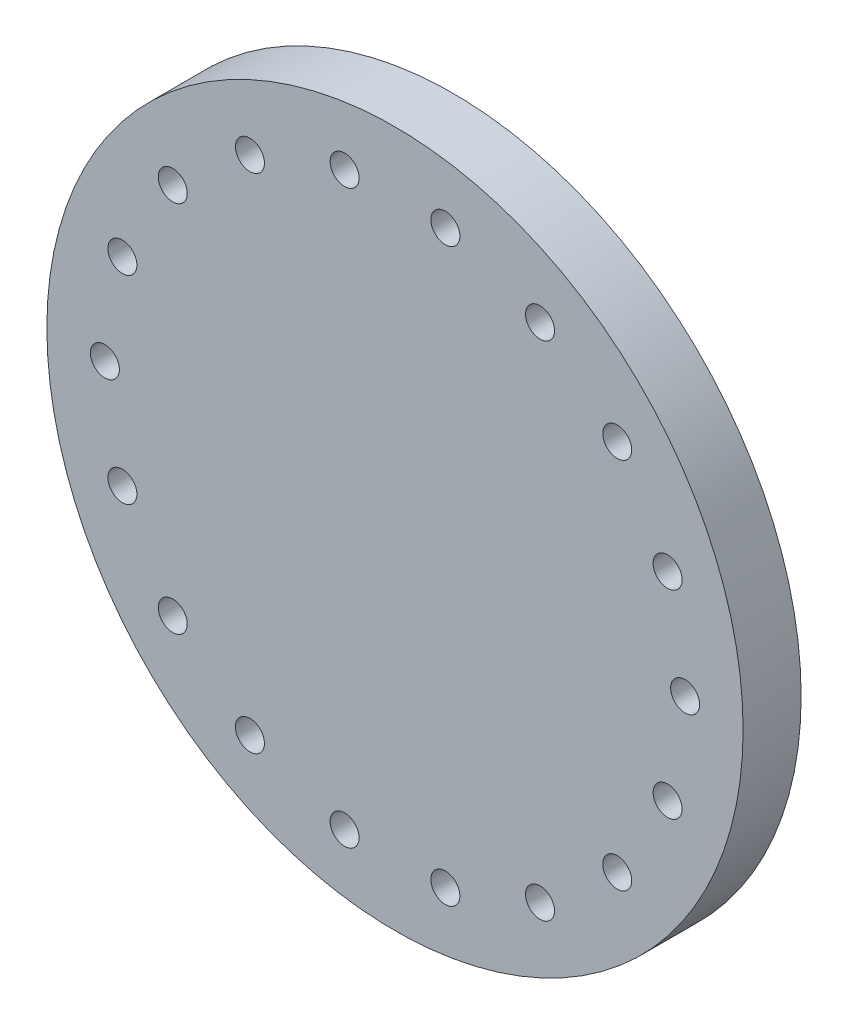
ISO-10303-21;
HEADER;
FILE_DESCRIPTION(('STEP AP214'),'2;1');
FILE_NAME('part.step','',(''),(''),'','','');
FILE_SCHEMA(('AUTOMOTIVE_DESIGN { 1 0 10303 214 1 1 1 1 }'));
ENDSEC;
DATA;
#1=APPLICATION_CONTEXT('core data for automotive mechanical design processes');
#2=APPLICATION_PROTOCOL_DEFINITION('international standard','automotive_design',2000,#1);
#3=PRODUCT_CONTEXT('',#1,'mechanical');
#4=PRODUCT('Part','Part','',(#3));
#5=PRODUCT_RELATED_PRODUCT_CATEGORY('part','',(#4));
#6=PRODUCT_DEFINITION_FORMATION('','',#4);
#7=PRODUCT_DEFINITION_CONTEXT('part definition',#1,'design');
#8=PRODUCT_DEFINITION('design','',#6,#7);
#9=PRODUCT_DEFINITION_SHAPE('','',#8);
#10=(LENGTH_UNIT() NAMED_UNIT(*) SI_UNIT(.MILLI.,.METRE.));
#11=(NAMED_UNIT(*) PLANE_ANGLE_UNIT() SI_UNIT($,.RADIAN.));
#12=(NAMED_UNIT(*) SI_UNIT($,.STERADIAN.) SOLID_ANGLE_UNIT());
#13=UNCERTAINTY_MEASURE_WITH_UNIT(LENGTH_MEASURE(1.E-05),#10,'distance_accuracy_value','');
#14=(GEOMETRIC_REPRESENTATION_CONTEXT(3) GLOBAL_UNCERTAINTY_ASSIGNED_CONTEXT((#13)) GLOBAL_UNIT_ASSIGNED_CONTEXT((#10,
#11,#12)) REPRESENTATION_CONTEXT('',''));
#15=CARTESIAN_POINT('',(0.,0.,0.));
#16=DIRECTION('',(0.,0.,1.));
#17=DIRECTION('',(1.,0.,0.));
#18=AXIS2_PLACEMENT_3D('',#15,#16,#17);
#19=CARTESIAN_POINT('',(0.,0.,12.7));
#20=DIRECTION('',(0.,0.,1.));
#21=DIRECTION('',(1.,0.,0.));
#22=AXIS2_PLACEMENT_3D('',#19,#20,#21);
#23=PLANE('',#22);
#24=CARTESIAN_POINT('',(-48.6438221380556,-40.8170132150947,12.7));
#25=DIRECTION('',(0.,0.,1.));
#26=DIRECTION('',(1.,0.,0.));
#27=AXIS2_PLACEMENT_3D('',#24,#25,#26);
#28=CIRCLE('',#27,3.175);
#29=CARTESIAN_POINT('',(-45.4688221380556,-40.8170132150947,12.7));
#30=VERTEX_POINT('',#29);
#31=EDGE_CURVE('E182',#30,#30,#28,.T.);
#32=ORIENTED_EDGE('',*,*,#31,.F.);
#33=EDGE_LOOP('',(#32));
#34=FACE_BOUND('',#33,.T.);
#35=CARTESIAN_POINT('',(-11.0266592818507,-62.5352923162751,12.7));
#36=DIRECTION('',(0.,0.,1.));
#37=DIRECTION('',(1.,0.,0.));
#38=AXIS2_PLACEMENT_3D('',#35,#36,#37);
#39=CIRCLE('',#38,3.175);
#40=CARTESIAN_POINT('',(-7.85165928185072,-62.5352923162751,12.7));
#41=VERTEX_POINT('',#40);
#42=EDGE_CURVE('E166',#41,#41,#39,.T.);
#43=ORIENTED_EDGE('',*,*,#42,.F.);
#44=EDGE_LOOP('',(#43));
#45=FACE_BOUND('',#44,.T.);
#46=CARTESIAN_POINT('',(31.7499999999995,-54.9926131403121,12.7));
#47=DIRECTION('',(0.,0.,1.));
#48=DIRECTION('',(1.,0.,0.));
#49=AXIS2_PLACEMENT_3D('',#46,#47,#48);
#50=CIRCLE('',#49,3.175);
#51=CARTESIAN_POINT('',(34.9249999999995,-54.9926131403121,12.7));
#52=VERTEX_POINT('',#51);
#53=EDGE_CURVE('E150',#52,#52,#50,.T.);
#54=ORIENTED_EDGE('',*,*,#53,.F.);
#55=EDGE_LOOP('',(#54));
#56=FACE_BOUND('',#55,.T.);
#57=CARTESIAN_POINT('',(59.670481419905,-21.7182791011804,12.7));
#58=DIRECTION('',(0.,0.,1.));
#59=DIRECTION('',(1.,0.,0.));
#60=AXIS2_PLACEMENT_3D('',#57,#58,#59);
#61=CIRCLE('',#60,3.175);
#62=CARTESIAN_POINT('',(62.845481419905,-21.7182791011804,12.7));
#63=VERTEX_POINT('',#62);
#64=EDGE_CURVE('E134',#63,#63,#61,.T.);
#65=ORIENTED_EDGE('',*,*,#64,.F.);
#66=EDGE_LOOP('',(#65));
#67=FACE_BOUND('',#66,.T.);
#68=CARTESIAN_POINT('',(59.6704814199053,21.7182791011796,12.7));
#69=DIRECTION('',(0.,0.,1.));
#70=DIRECTION('',(1.,0.,0.));
#71=AXIS2_PLACEMENT_3D('',#68,#69,#70);
#72=CIRCLE('',#71,3.175);
#73=CARTESIAN_POINT('',(62.8454814199053,21.7182791011796,12.7));
#74=VERTEX_POINT('',#73);
#75=EDGE_CURVE('E118',#74,#74,#72,.T.);
#76=ORIENTED_EDGE('',*,*,#75,.F.);
#77=EDGE_LOOP('',(#76));
#78=FACE_BOUND('',#77,.T.);
#79=CARTESIAN_POINT('',(31.7500000000003,54.9926131403117,12.7));
#80=DIRECTION('',(0.,0.,1.));
#81=DIRECTION('',(1.,0.,0.));
#82=AXIS2_PLACEMENT_3D('',#79,#80,#81);
#83=CIRCLE('',#82,3.175);
#84=CARTESIAN_POINT('',(34.9250000000003,54.9926131403117,12.7));
#85=VERTEX_POINT('',#84);
#86=EDGE_CURVE('E102',#85,#85,#83,.T.);
#87=ORIENTED_EDGE('',*,*,#86,.F.);
#88=EDGE_LOOP('',(#87));
#89=FACE_BOUND('',#88,.T.);
#90=CARTESIAN_POINT('',(-11.0266592818499,62.5352923162752,12.7));
#91=DIRECTION('',(0.,0.,1.));
#92=DIRECTION('',(1.,0.,0.));
#93=AXIS2_PLACEMENT_3D('',#90,#91,#92);
#94=CIRCLE('',#93,3.175);
#95=CARTESIAN_POINT('',(-7.85165928184989,62.5352923162752,12.7));
#96=VERTEX_POINT('',#95);
#97=EDGE_CURVE('E86',#96,#96,#94,.T.);
#98=ORIENTED_EDGE('',*,*,#97,.F.);
#99=EDGE_LOOP('',(#98));
#100=FACE_BOUND('',#99,.T.);
#101=CARTESIAN_POINT('',(-48.6438221380551,40.8170132150953,12.7));
#102=DIRECTION('',(0.,0.,1.));
#103=DIRECTION('',(1.,0.,0.));
#104=AXIS2_PLACEMENT_3D('',#101,#102,#103);
#105=CIRCLE('',#104,3.175);
#106=CARTESIAN_POINT('',(-45.4688221380551,40.8170132150953,12.7));
#107=VERTEX_POINT('',#106);
#108=EDGE_CURVE('E70',#107,#107,#105,.T.);
#109=ORIENTED_EDGE('',*,*,#108,.F.);
#110=EDGE_LOOP('',(#109));
#111=FACE_BOUND('',#110,.T.);
#112=CARTESIAN_POINT('',(-63.5,0.,12.7));
#113=DIRECTION('',(0.,0.,1.));
#114=DIRECTION('',(1.,0.,0.));
#115=AXIS2_PLACEMENT_3D('',#112,#113,#114);
#116=CIRCLE('',#115,3.175);
#117=CARTESIAN_POINT('',(-60.325,0.,12.7));
#118=VERTEX_POINT('',#117);
#119=EDGE_CURVE('E56',#118,#118,#116,.T.);
#120=ORIENTED_EDGE('',*,*,#119,.F.);
#121=EDGE_LOOP('',(#120));
#122=FACE_BOUND('',#121,.T.);
#123=CARTESIAN_POINT('',(0.,0.,12.7));
#124=DIRECTION('',(0.,0.,1.));
#125=DIRECTION('',(1.,0.,0.));
#126=AXIS2_PLACEMENT_3D('',#123,#124,#125);
#127=CIRCLE('',#126,76.2);
#128=CARTESIAN_POINT('',(76.2,0.,12.7));
#129=VERTEX_POINT('',#128);
#130=EDGE_CURVE('E10',#129,#129,#127,.T.);
#131=ORIENTED_EDGE('',*,*,#130,.T.);
#132=EDGE_LOOP('',(#131));
#133=FACE_BOUND('',#132,.T.);
#134=CARTESIAN_POINT('',(-59.6704814199052,21.71827910118,12.7));
#135=DIRECTION('',(0.,0.,1.));
#136=DIRECTION('',(1.,0.,0.));
#137=AXIS2_PLACEMENT_3D('',#134,#135,#136);
#138=CIRCLE('',#137,3.175);
#139=CARTESIAN_POINT('',(-56.4954814199052,21.71827910118,12.7));
#140=VERTEX_POINT('',#139);
#141=EDGE_CURVE('E62',#140,#140,#138,.T.);
#142=ORIENTED_EDGE('',*,*,#141,.F.);
#143=EDGE_LOOP('',(#142));
#144=FACE_BOUND('',#143,.T.);
#145=CARTESIAN_POINT('',(-31.7499999999999,54.9926131403119,12.7));
#146=DIRECTION('',(0.,0.,1.));
#147=DIRECTION('',(1.,0.,0.));
#148=AXIS2_PLACEMENT_3D('',#145,#146,#147);
#149=CIRCLE('',#148,3.175);
#150=CARTESIAN_POINT('',(-28.5749999999999,54.9926131403119,12.7));
#151=VERTEX_POINT('',#150);
#152=EDGE_CURVE('E78',#151,#151,#149,.T.);
#153=ORIENTED_EDGE('',*,*,#152,.F.);
#154=EDGE_LOOP('',(#153));
#155=FACE_BOUND('',#154,.T.);
#156=CARTESIAN_POINT('',(11.0266592818503,62.5352923162752,12.7));
#157=DIRECTION('',(0.,0.,1.));
#158=DIRECTION('',(1.,0.,0.));
#159=AXIS2_PLACEMENT_3D('',#156,#157,#158);
#160=CIRCLE('',#159,3.175);
#161=CARTESIAN_POINT('',(14.2016592818503,62.5352923162752,12.7));
#162=VERTEX_POINT('',#161);
#163=EDGE_CURVE('E94',#162,#162,#160,.T.);
#164=ORIENTED_EDGE('',*,*,#163,.F.);
#165=EDGE_LOOP('',(#164));
#166=FACE_BOUND('',#165,.T.);
#167=CARTESIAN_POINT('',(48.6438221380553,40.817013215095,12.7));
#168=DIRECTION('',(0.,0.,1.));
#169=DIRECTION('',(1.,0.,0.));
#170=AXIS2_PLACEMENT_3D('',#167,#168,#169);
#171=CIRCLE('',#170,3.175);
#172=CARTESIAN_POINT('',(51.8188221380553,40.817013215095,12.7));
#173=VERTEX_POINT('',#172);
#174=EDGE_CURVE('E110',#173,#173,#171,.T.);
#175=ORIENTED_EDGE('',*,*,#174,.F.);
#176=EDGE_LOOP('',(#175));
#177=FACE_BOUND('',#176,.T.);
#178=CARTESIAN_POINT('',(63.5,-4.43418130033078E-13,12.7));
#179=DIRECTION('',(0.,0.,1.));
#180=DIRECTION('',(1.,0.,0.));
#181=AXIS2_PLACEMENT_3D('',#178,#179,#180);
#182=CIRCLE('',#181,3.175);
#183=CARTESIAN_POINT('',(66.675,-4.43418130033078E-13,12.7));
#184=VERTEX_POINT('',#183);
#185=EDGE_CURVE('E126',#184,#184,#182,.T.);
#186=ORIENTED_EDGE('',*,*,#185,.F.);
#187=EDGE_LOOP('',(#186));
#188=FACE_BOUND('',#187,.T.);
#189=CARTESIAN_POINT('',(48.6438221380548,-40.8170132150957,12.7));
#190=DIRECTION('',(0.,0.,1.));
#191=DIRECTION('',(1.,0.,0.));
#192=AXIS2_PLACEMENT_3D('',#189,#190,#191);
#193=CIRCLE('',#192,3.175);
#194=CARTESIAN_POINT('',(51.8188221380548,-40.8170132150957,12.7));
#195=VERTEX_POINT('',#194);
#196=EDGE_CURVE('E142',#195,#195,#193,.T.);
#197=ORIENTED_EDGE('',*,*,#196,.F.);
#198=EDGE_LOOP('',(#197));
#199=FACE_BOUND('',#198,.T.);
#200=CARTESIAN_POINT('',(11.0266592818495,-62.5352923162753,12.7));
#201=DIRECTION('',(0.,0.,1.));
#202=DIRECTION('',(1.,0.,0.));
#203=AXIS2_PLACEMENT_3D('',#200,#201,#202);
#204=CIRCLE('',#203,3.175);
#205=CARTESIAN_POINT('',(14.2016592818495,-62.5352923162753,12.7));
#206=VERTEX_POINT('',#205);
#207=EDGE_CURVE('E158',#206,#206,#204,.T.);
#208=ORIENTED_EDGE('',*,*,#207,.F.);
#209=EDGE_LOOP('',(#208));
#210=FACE_BOUND('',#209,.T.);
#211=CARTESIAN_POINT('',(-31.7500000000006,-54.9926131403115,12.7));
#212=DIRECTION('',(0.,0.,1.));
#213=DIRECTION('',(1.,0.,0.));
#214=AXIS2_PLACEMENT_3D('',#211,#212,#213);
#215=CIRCLE('',#214,3.175);
#216=CARTESIAN_POINT('',(-28.5750000000006,-54.9926131403115,12.7));
#217=VERTEX_POINT('',#216);
#218=EDGE_CURVE('E174',#217,#217,#215,.T.);
#219=ORIENTED_EDGE('',*,*,#218,.F.);
#220=EDGE_LOOP('',(#219));
#221=FACE_BOUND('',#220,.T.);
#222=CARTESIAN_POINT('',(-59.6704814199055,-21.7182791011792,12.7));
#223=DIRECTION('',(0.,0.,1.));
#224=DIRECTION('',(1.,0.,0.));
#225=AXIS2_PLACEMENT_3D('',#222,#223,#224);
#226=CIRCLE('',#225,3.175);
#227=CARTESIAN_POINT('',(-56.4954814199055,-21.7182791011792,12.7));
#228=VERTEX_POINT('',#227);
#229=EDGE_CURVE('E190',#228,#228,#226,.T.);
#230=ORIENTED_EDGE('',*,*,#229,.F.);
#231=EDGE_LOOP('',(#230));
#232=FACE_BOUND('',#231,.T.);
#233=ADVANCED_FACE('F43',(#34,#45,#56,#67,#78,#89,#100,#111,#122,#133,#144,#155,#166,#177,#188,
#199,#210,#221,#232),#23,.T.);
#234=CARTESIAN_POINT('',(0.,0.,0.));
#235=DIRECTION('',(0.,0.,1.));
#236=DIRECTION('',(1.,0.,0.));
#237=AXIS2_PLACEMENT_3D('',#234,#235,#236);
#238=PLANE('',#237);
#239=CARTESIAN_POINT('',(0.,0.,0.));
#240=DIRECTION('',(0.,0.,1.));
#241=DIRECTION('',(1.,0.,0.));
#242=AXIS2_PLACEMENT_3D('',#239,#240,#241);
#243=CIRCLE('',#242,76.2);
#244=CARTESIAN_POINT('',(76.2,0.,0.));
#245=VERTEX_POINT('',#244);
#246=EDGE_CURVE('E47',#245,#245,#243,.T.);
#247=ORIENTED_EDGE('',*,*,#246,.F.);
#248=EDGE_LOOP('',(#247));
#249=FACE_BOUND('',#248,.T.);
#250=CARTESIAN_POINT('',(-63.5,0.,0.));
#251=DIRECTION('',(0.,0.,1.));
#252=DIRECTION('',(1.,0.,0.));
#253=AXIS2_PLACEMENT_3D('',#250,#251,#252);
#254=CIRCLE('',#253,3.175);
#255=CARTESIAN_POINT('',(-60.325,0.,0.));
#256=VERTEX_POINT('',#255);
#257=EDGE_CURVE('E58',#256,#256,#254,.T.);
#258=ORIENTED_EDGE('',*,*,#257,.T.);
#259=EDGE_LOOP('',(#258));
#260=FACE_BOUND('',#259,.T.);
#261=CARTESIAN_POINT('',(-59.6704814199052,21.71827910118,0.));
#262=DIRECTION('',(0.,0.,1.));
#263=DIRECTION('',(1.,0.,0.));
#264=AXIS2_PLACEMENT_3D('',#261,#262,#263);
#265=CIRCLE('',#264,3.175);
#266=CARTESIAN_POINT('',(-56.4954814199052,21.71827910118,0.));
#267=VERTEX_POINT('',#266);
#268=EDGE_CURVE('E66',#267,#267,#265,.T.);
#269=ORIENTED_EDGE('',*,*,#268,.T.);
#270=EDGE_LOOP('',(#269));
#271=FACE_BOUND('',#270,.T.);
#272=CARTESIAN_POINT('',(-48.6438221380551,40.8170132150953,0.));
#273=DIRECTION('',(0.,0.,1.));
#274=DIRECTION('',(1.,0.,0.));
#275=AXIS2_PLACEMENT_3D('',#272,#273,#274);
#276=CIRCLE('',#275,3.175);
#277=CARTESIAN_POINT('',(-45.4688221380551,40.8170132150953,0.));
#278=VERTEX_POINT('',#277);
#279=EDGE_CURVE('E74',#278,#278,#276,.T.);
#280=ORIENTED_EDGE('',*,*,#279,.T.);
#281=EDGE_LOOP('',(#280));
#282=FACE_BOUND('',#281,.T.);
#283=CARTESIAN_POINT('',(-31.7499999999999,54.9926131403119,0.));
#284=DIRECTION('',(0.,0.,1.));
#285=DIRECTION('',(1.,0.,0.));
#286=AXIS2_PLACEMENT_3D('',#283,#284,#285);
#287=CIRCLE('',#286,3.175);
#288=CARTESIAN_POINT('',(-28.5749999999999,54.9926131403119,0.));
#289=VERTEX_POINT('',#288);
#290=EDGE_CURVE('E82',#289,#289,#287,.T.);
#291=ORIENTED_EDGE('',*,*,#290,.T.);
#292=EDGE_LOOP('',(#291));
#293=FACE_BOUND('',#292,.T.);
#294=CARTESIAN_POINT('',(-11.0266592818499,62.5352923162752,0.));
#295=DIRECTION('',(0.,0.,1.));
#296=DIRECTION('',(1.,0.,0.));
#297=AXIS2_PLACEMENT_3D('',#294,#295,#296);
#298=CIRCLE('',#297,3.175);
#299=CARTESIAN_POINT('',(-7.85165928184989,62.5352923162752,0.));
#300=VERTEX_POINT('',#299);
#301=EDGE_CURVE('E90',#300,#300,#298,.T.);
#302=ORIENTED_EDGE('',*,*,#301,.T.);
#303=EDGE_LOOP('',(#302));
#304=FACE_BOUND('',#303,.T.);
#305=CARTESIAN_POINT('',(11.0266592818503,62.5352923162752,0.));
#306=DIRECTION('',(0.,0.,1.));
#307=DIRECTION('',(1.,0.,0.));
#308=AXIS2_PLACEMENT_3D('',#305,#306,#307);
#309=CIRCLE('',#308,3.175);
#310=CARTESIAN_POINT('',(14.2016592818503,62.5352923162752,0.));
#311=VERTEX_POINT('',#310);
#312=EDGE_CURVE('E98',#311,#311,#309,.T.);
#313=ORIENTED_EDGE('',*,*,#312,.T.);
#314=EDGE_LOOP('',(#313));
#315=FACE_BOUND('',#314,.T.);
#316=CARTESIAN_POINT('',(31.7500000000003,54.9926131403117,0.));
#317=DIRECTION('',(0.,0.,1.));
#318=DIRECTION('',(1.,0.,0.));
#319=AXIS2_PLACEMENT_3D('',#316,#317,#318);
#320=CIRCLE('',#319,3.175);
#321=CARTESIAN_POINT('',(34.9250000000003,54.9926131403117,0.));
#322=VERTEX_POINT('',#321);
#323=EDGE_CURVE('E106',#322,#322,#320,.T.);
#324=ORIENTED_EDGE('',*,*,#323,.T.);
#325=EDGE_LOOP('',(#324));
#326=FACE_BOUND('',#325,.T.);
#327=CARTESIAN_POINT('',(48.6438221380553,40.817013215095,0.));
#328=DIRECTION('',(0.,0.,1.));
#329=DIRECTION('',(1.,0.,0.));
#330=AXIS2_PLACEMENT_3D('',#327,#328,#329);
#331=CIRCLE('',#330,3.175);
#332=CARTESIAN_POINT('',(51.8188221380553,40.817013215095,0.));
#333=VERTEX_POINT('',#332);
#334=EDGE_CURVE('E114',#333,#333,#331,.T.);
#335=ORIENTED_EDGE('',*,*,#334,.T.);
#336=EDGE_LOOP('',(#335));
#337=FACE_BOUND('',#336,.T.);
#338=CARTESIAN_POINT('',(59.6704814199053,21.7182791011796,0.));
#339=DIRECTION('',(0.,0.,1.));
#340=DIRECTION('',(1.,0.,0.));
#341=AXIS2_PLACEMENT_3D('',#338,#339,#340);
#342=CIRCLE('',#341,3.175);
#343=CARTESIAN_POINT('',(62.8454814199053,21.7182791011796,0.));
#344=VERTEX_POINT('',#343);
#345=EDGE_CURVE('E122',#344,#344,#342,.T.);
#346=ORIENTED_EDGE('',*,*,#345,.T.);
#347=EDGE_LOOP('',(#346));
#348=FACE_BOUND('',#347,.T.);
#349=CARTESIAN_POINT('',(63.5,-4.43418130033078E-13,0.));
#350=DIRECTION('',(0.,0.,1.));
#351=DIRECTION('',(1.,0.,0.));
#352=AXIS2_PLACEMENT_3D('',#349,#350,#351);
#353=CIRCLE('',#352,3.175);
#354=CARTESIAN_POINT('',(66.675,-4.43418130033078E-13,0.));
#355=VERTEX_POINT('',#354);
#356=EDGE_CURVE('E130',#355,#355,#353,.T.);
#357=ORIENTED_EDGE('',*,*,#356,.T.);
#358=EDGE_LOOP('',(#357));
#359=FACE_BOUND('',#358,.T.);
#360=CARTESIAN_POINT('',(59.670481419905,-21.7182791011804,0.));
#361=DIRECTION('',(0.,0.,1.));
#362=DIRECTION('',(1.,0.,0.));
#363=AXIS2_PLACEMENT_3D('',#360,#361,#362);
#364=CIRCLE('',#363,3.175);
#365=CARTESIAN_POINT('',(62.845481419905,-21.7182791011804,0.));
#366=VERTEX_POINT('',#365);
#367=EDGE_CURVE('E138',#366,#366,#364,.T.);
#368=ORIENTED_EDGE('',*,*,#367,.T.);
#369=EDGE_LOOP('',(#368));
#370=FACE_BOUND('',#369,.T.);
#371=CARTESIAN_POINT('',(48.6438221380548,-40.8170132150957,0.));
#372=DIRECTION('',(0.,0.,1.));
#373=DIRECTION('',(1.,0.,0.));
#374=AXIS2_PLACEMENT_3D('',#371,#372,#373);
#375=CIRCLE('',#374,3.175);
#376=CARTESIAN_POINT('',(51.8188221380548,-40.8170132150957,0.));
#377=VERTEX_POINT('',#376);
#378=EDGE_CURVE('E146',#377,#377,#375,.T.);
#379=ORIENTED_EDGE('',*,*,#378,.T.);
#380=EDGE_LOOP('',(#379));
#381=FACE_BOUND('',#380,.T.);
#382=CARTESIAN_POINT('',(31.7499999999995,-54.9926131403121,0.));
#383=DIRECTION('',(0.,0.,1.));
#384=DIRECTION('',(1.,0.,0.));
#385=AXIS2_PLACEMENT_3D('',#382,#383,#384);
#386=CIRCLE('',#385,3.175);
#387=CARTESIAN_POINT('',(34.9249999999995,-54.9926131403121,0.));
#388=VERTEX_POINT('',#387);
#389=EDGE_CURVE('E154',#388,#388,#386,.T.);
#390=ORIENTED_EDGE('',*,*,#389,.T.);
#391=EDGE_LOOP('',(#390));
#392=FACE_BOUND('',#391,.T.);
#393=CARTESIAN_POINT('',(11.0266592818495,-62.5352923162753,0.));
#394=DIRECTION('',(0.,0.,1.));
#395=DIRECTION('',(1.,0.,0.));
#396=AXIS2_PLACEMENT_3D('',#393,#394,#395);
#397=CIRCLE('',#396,3.175);
#398=CARTESIAN_POINT('',(14.2016592818495,-62.5352923162753,0.));
#399=VERTEX_POINT('',#398);
#400=EDGE_CURVE('E162',#399,#399,#397,.T.);
#401=ORIENTED_EDGE('',*,*,#400,.T.);
#402=EDGE_LOOP('',(#401));
#403=FACE_BOUND('',#402,.T.);
#404=CARTESIAN_POINT('',(-11.0266592818507,-62.5352923162751,0.));
#405=DIRECTION('',(0.,0.,1.));
#406=DIRECTION('',(1.,0.,0.));
#407=AXIS2_PLACEMENT_3D('',#404,#405,#406);
#408=CIRCLE('',#407,3.175);
#409=CARTESIAN_POINT('',(-7.85165928185072,-62.5352923162751,0.));
#410=VERTEX_POINT('',#409);
#411=EDGE_CURVE('E170',#410,#410,#408,.T.);
#412=ORIENTED_EDGE('',*,*,#411,.T.);
#413=EDGE_LOOP('',(#412));
#414=FACE_BOUND('',#413,.T.);
#415=CARTESIAN_POINT('',(-31.7500000000006,-54.9926131403115,0.));
#416=DIRECTION('',(0.,0.,1.));
#417=DIRECTION('',(1.,0.,0.));
#418=AXIS2_PLACEMENT_3D('',#415,#416,#417);
#419=CIRCLE('',#418,3.175);
#420=CARTESIAN_POINT('',(-28.5750000000006,-54.9926131403115,0.));
#421=VERTEX_POINT('',#420);
#422=EDGE_CURVE('E178',#421,#421,#419,.T.);
#423=ORIENTED_EDGE('',*,*,#422,.T.);
#424=EDGE_LOOP('',(#423));
#425=FACE_BOUND('',#424,.T.);
#426=CARTESIAN_POINT('',(-48.6438221380556,-40.8170132150947,0.));
#427=DIRECTION('',(0.,0.,1.));
#428=DIRECTION('',(1.,0.,0.));
#429=AXIS2_PLACEMENT_3D('',#426,#427,#428);
#430=CIRCLE('',#429,3.175);
#431=CARTESIAN_POINT('',(-45.4688221380556,-40.8170132150947,0.));
#432=VERTEX_POINT('',#431);
#433=EDGE_CURVE('E186',#432,#432,#430,.T.);
#434=ORIENTED_EDGE('',*,*,#433,.T.);
#435=EDGE_LOOP('',(#434));
#436=FACE_BOUND('',#435,.T.);
#437=CARTESIAN_POINT('',(-59.6704814199055,-21.7182791011792,0.));
#438=DIRECTION('',(0.,0.,1.));
#439=DIRECTION('',(1.,0.,0.));
#440=AXIS2_PLACEMENT_3D('',#437,#438,#439);
#441=CIRCLE('',#440,3.175);
#442=CARTESIAN_POINT('',(-56.4954814199055,-21.7182791011792,0.));
#443=VERTEX_POINT('',#442);
#444=EDGE_CURVE('E194',#443,#443,#441,.T.);
#445=ORIENTED_EDGE('',*,*,#444,.T.);
#446=EDGE_LOOP('',(#445));
#447=FACE_BOUND('',#446,.T.);
#448=ADVANCED_FACE('F206',(#249,#260,#271,#282,#293,#304,#315,#326,#337,#348,#359,#370,#381,
#392,#403,#414,#425,#436,#447),#238,.F.);
#449=CARTESIAN_POINT('',(0.,0.,12.7));
#450=DIRECTION('',(0.,0.,-1.));
#451=DIRECTION('',(-1.,0.,0.));
#452=AXIS2_PLACEMENT_3D('',#449,#450,#451);
#453=CYLINDRICAL_SURFACE('',#452,76.2);
#454=ORIENTED_EDGE('',*,*,#130,.F.);
#455=EDGE_LOOP('',(#454));
#456=FACE_BOUND('',#455,.T.);
#457=ORIENTED_EDGE('',*,*,#246,.T.);
#458=EDGE_LOOP('',(#457));
#459=FACE_BOUND('',#458,.T.);
#460=ADVANCED_FACE('F45',(#456,#459),#453,.T.);
#461=CARTESIAN_POINT('',(-63.5,0.,12.7));
#462=DIRECTION('',(0.,0.,-1.));
#463=DIRECTION('',(-1.,0.,0.));
#464=AXIS2_PLACEMENT_3D('',#461,#462,#463);
#465=CYLINDRICAL_SURFACE('',#464,3.175);
#466=ORIENTED_EDGE('',*,*,#119,.T.);
#467=EDGE_LOOP('',(#466));
#468=FACE_BOUND('',#467,.T.);
#469=ORIENTED_EDGE('',*,*,#257,.F.);
#470=EDGE_LOOP('',(#469));
#471=FACE_BOUND('',#470,.T.);
#472=ADVANCED_FACE('F216',(#468,#471),#465,.F.);
#473=CARTESIAN_POINT('',(-59.6704814199052,21.71827910118,12.7));
#474=DIRECTION('',(0.,0.,-1.));
#475=DIRECTION('',(-1.,0.,0.));
#476=AXIS2_PLACEMENT_3D('',#473,#474,#475);
#477=CYLINDRICAL_SURFACE('',#476,3.175);
#478=ORIENTED_EDGE('',*,*,#141,.T.);
#479=EDGE_LOOP('',(#478));
#480=FACE_BOUND('',#479,.T.);
#481=ORIENTED_EDGE('',*,*,#268,.F.);
#482=EDGE_LOOP('',(#481));
#483=FACE_BOUND('',#482,.T.);
#484=ADVANCED_FACE('F219',(#480,#483),#477,.F.);
#485=CARTESIAN_POINT('',(-48.6438221380551,40.8170132150953,12.7));
#486=DIRECTION('',(0.,0.,-1.));
#487=DIRECTION('',(-1.,0.,0.));
#488=AXIS2_PLACEMENT_3D('',#485,#486,#487);
#489=CYLINDRICAL_SURFACE('',#488,3.175);
#490=ORIENTED_EDGE('',*,*,#108,.T.);
#491=EDGE_LOOP('',(#490));
#492=FACE_BOUND('',#491,.T.);
#493=ORIENTED_EDGE('',*,*,#279,.F.);
#494=EDGE_LOOP('',(#493));
#495=FACE_BOUND('',#494,.T.);
#496=ADVANCED_FACE('F223',(#492,#495),#489,.F.);
#497=CARTESIAN_POINT('',(-31.7499999999999,54.9926131403119,12.7));
#498=DIRECTION('',(0.,0.,-1.));
#499=DIRECTION('',(-1.,0.,0.));
#500=AXIS2_PLACEMENT_3D('',#497,#498,#499);
#501=CYLINDRICAL_SURFACE('',#500,3.175);
#502=ORIENTED_EDGE('',*,*,#152,.T.);
#503=EDGE_LOOP('',(#502));
#504=FACE_BOUND('',#503,.T.);
#505=ORIENTED_EDGE('',*,*,#290,.F.);
#506=EDGE_LOOP('',(#505));
#507=FACE_BOUND('',#506,.T.);
#508=ADVANCED_FACE('F227',(#504,#507),#501,.F.);
#509=CARTESIAN_POINT('',(-11.0266592818499,62.5352923162752,12.7));
#510=DIRECTION('',(0.,0.,-1.));
#511=DIRECTION('',(-1.,0.,0.));
#512=AXIS2_PLACEMENT_3D('',#509,#510,#511);
#513=CYLINDRICAL_SURFACE('',#512,3.175);
#514=ORIENTED_EDGE('',*,*,#97,.T.);
#515=EDGE_LOOP('',(#514));
#516=FACE_BOUND('',#515,.T.);
#517=ORIENTED_EDGE('',*,*,#301,.F.);
#518=EDGE_LOOP('',(#517));
#519=FACE_BOUND('',#518,.T.);
#520=ADVANCED_FACE('F231',(#516,#519),#513,.F.);
#521=CARTESIAN_POINT('',(11.0266592818503,62.5352923162752,12.7));
#522=DIRECTION('',(0.,0.,-1.));
#523=DIRECTION('',(-1.,0.,0.));
#524=AXIS2_PLACEMENT_3D('',#521,#522,#523);
#525=CYLINDRICAL_SURFACE('',#524,3.175);
#526=ORIENTED_EDGE('',*,*,#163,.T.);
#527=EDGE_LOOP('',(#526));
#528=FACE_BOUND('',#527,.T.);
#529=ORIENTED_EDGE('',*,*,#312,.F.);
#530=EDGE_LOOP('',(#529));
#531=FACE_BOUND('',#530,.T.);
#532=ADVANCED_FACE('F235',(#528,#531),#525,.F.);
#533=CARTESIAN_POINT('',(31.7500000000003,54.9926131403117,12.7));
#534=DIRECTION('',(0.,0.,-1.));
#535=DIRECTION('',(-1.,0.,0.));
#536=AXIS2_PLACEMENT_3D('',#533,#534,#535);
#537=CYLINDRICAL_SURFACE('',#536,3.175);
#538=ORIENTED_EDGE('',*,*,#86,.T.);
#539=EDGE_LOOP('',(#538));
#540=FACE_BOUND('',#539,.T.);
#541=ORIENTED_EDGE('',*,*,#323,.F.);
#542=EDGE_LOOP('',(#541));
#543=FACE_BOUND('',#542,.T.);
#544=ADVANCED_FACE('F239',(#540,#543),#537,.F.);
#545=CARTESIAN_POINT('',(48.6438221380553,40.817013215095,12.7));
#546=DIRECTION('',(0.,0.,-1.));
#547=DIRECTION('',(-1.,0.,0.));
#548=AXIS2_PLACEMENT_3D('',#545,#546,#547);
#549=CYLINDRICAL_SURFACE('',#548,3.175);
#550=ORIENTED_EDGE('',*,*,#174,.T.);
#551=EDGE_LOOP('',(#550));
#552=FACE_BOUND('',#551,.T.);
#553=ORIENTED_EDGE('',*,*,#334,.F.);
#554=EDGE_LOOP('',(#553));
#555=FACE_BOUND('',#554,.T.);
#556=ADVANCED_FACE('F243',(#552,#555),#549,.F.);
#557=CARTESIAN_POINT('',(59.6704814199053,21.7182791011796,12.7));
#558=DIRECTION('',(0.,0.,-1.));
#559=DIRECTION('',(-1.,0.,0.));
#560=AXIS2_PLACEMENT_3D('',#557,#558,#559);
#561=CYLINDRICAL_SURFACE('',#560,3.175);
#562=ORIENTED_EDGE('',*,*,#75,.T.);
#563=EDGE_LOOP('',(#562));
#564=FACE_BOUND('',#563,.T.);
#565=ORIENTED_EDGE('',*,*,#345,.F.);
#566=EDGE_LOOP('',(#565));
#567=FACE_BOUND('',#566,.T.);
#568=ADVANCED_FACE('F247',(#564,#567),#561,.F.);
#569=CARTESIAN_POINT('',(63.5,-4.43418130033078E-13,12.7));
#570=DIRECTION('',(0.,0.,-1.));
#571=DIRECTION('',(-1.,0.,0.));
#572=AXIS2_PLACEMENT_3D('',#569,#570,#571);
#573=CYLINDRICAL_SURFACE('',#572,3.175);
#574=ORIENTED_EDGE('',*,*,#185,.T.);
#575=EDGE_LOOP('',(#574));
#576=FACE_BOUND('',#575,.T.);
#577=ORIENTED_EDGE('',*,*,#356,.F.);
#578=EDGE_LOOP('',(#577));
#579=FACE_BOUND('',#578,.T.);
#580=ADVANCED_FACE('F251',(#576,#579),#573,.F.);
#581=CARTESIAN_POINT('',(59.670481419905,-21.7182791011804,12.7));
#582=DIRECTION('',(0.,0.,-1.));
#583=DIRECTION('',(-1.,0.,0.));
#584=AXIS2_PLACEMENT_3D('',#581,#582,#583);
#585=CYLINDRICAL_SURFACE('',#584,3.175);
#586=ORIENTED_EDGE('',*,*,#64,.T.);
#587=EDGE_LOOP('',(#586));
#588=FACE_BOUND('',#587,.T.);
#589=ORIENTED_EDGE('',*,*,#367,.F.);
#590=EDGE_LOOP('',(#589));
#591=FACE_BOUND('',#590,.T.);
#592=ADVANCED_FACE('F255',(#588,#591),#585,.F.);
#593=CARTESIAN_POINT('',(48.6438221380548,-40.8170132150957,12.7));
#594=DIRECTION('',(0.,0.,-1.));
#595=DIRECTION('',(-1.,0.,0.));
#596=AXIS2_PLACEMENT_3D('',#593,#594,#595);
#597=CYLINDRICAL_SURFACE('',#596,3.175);
#598=ORIENTED_EDGE('',*,*,#196,.T.);
#599=EDGE_LOOP('',(#598));
#600=FACE_BOUND('',#599,.T.);
#601=ORIENTED_EDGE('',*,*,#378,.F.);
#602=EDGE_LOOP('',(#601));
#603=FACE_BOUND('',#602,.T.);
#604=ADVANCED_FACE('F259',(#600,#603),#597,.F.);
#605=CARTESIAN_POINT('',(31.7499999999995,-54.9926131403121,12.7));
#606=DIRECTION('',(0.,0.,-1.));
#607=DIRECTION('',(-1.,0.,0.));
#608=AXIS2_PLACEMENT_3D('',#605,#606,#607);
#609=CYLINDRICAL_SURFACE('',#608,3.175);
#610=ORIENTED_EDGE('',*,*,#53,.T.);
#611=EDGE_LOOP('',(#610));
#612=FACE_BOUND('',#611,.T.);
#613=ORIENTED_EDGE('',*,*,#389,.F.);
#614=EDGE_LOOP('',(#613));
#615=FACE_BOUND('',#614,.T.);
#616=ADVANCED_FACE('F263',(#612,#615),#609,.F.);
#617=CARTESIAN_POINT('',(11.0266592818495,-62.5352923162753,12.7));
#618=DIRECTION('',(0.,0.,-1.));
#619=DIRECTION('',(-1.,0.,0.));
#620=AXIS2_PLACEMENT_3D('',#617,#618,#619);
#621=CYLINDRICAL_SURFACE('',#620,3.175);
#622=ORIENTED_EDGE('',*,*,#207,.T.);
#623=EDGE_LOOP('',(#622));
#624=FACE_BOUND('',#623,.T.);
#625=ORIENTED_EDGE('',*,*,#400,.F.);
#626=EDGE_LOOP('',(#625));
#627=FACE_BOUND('',#626,.T.);
#628=ADVANCED_FACE('F267',(#624,#627),#621,.F.);
#629=CARTESIAN_POINT('',(-11.0266592818507,-62.5352923162751,12.7));
#630=DIRECTION('',(0.,0.,-1.));
#631=DIRECTION('',(-1.,0.,0.));
#632=AXIS2_PLACEMENT_3D('',#629,#630,#631);
#633=CYLINDRICAL_SURFACE('',#632,3.175);
#634=ORIENTED_EDGE('',*,*,#42,.T.);
#635=EDGE_LOOP('',(#634));
#636=FACE_BOUND('',#635,.T.);
#637=ORIENTED_EDGE('',*,*,#411,.F.);
#638=EDGE_LOOP('',(#637));
#639=FACE_BOUND('',#638,.T.);
#640=ADVANCED_FACE('F271',(#636,#639),#633,.F.);
#641=CARTESIAN_POINT('',(-31.7500000000006,-54.9926131403115,12.7));
#642=DIRECTION('',(0.,0.,-1.));
#643=DIRECTION('',(-1.,0.,0.));
#644=AXIS2_PLACEMENT_3D('',#641,#642,#643);
#645=CYLINDRICAL_SURFACE('',#644,3.175);
#646=ORIENTED_EDGE('',*,*,#218,.T.);
#647=EDGE_LOOP('',(#646));
#648=FACE_BOUND('',#647,.T.);
#649=ORIENTED_EDGE('',*,*,#422,.F.);
#650=EDGE_LOOP('',(#649));
#651=FACE_BOUND('',#650,.T.);
#652=ADVANCED_FACE('F275',(#648,#651),#645,.F.);
#653=CARTESIAN_POINT('',(-48.6438221380556,-40.8170132150947,12.7));
#654=DIRECTION('',(0.,0.,-1.));
#655=DIRECTION('',(-1.,0.,0.));
#656=AXIS2_PLACEMENT_3D('',#653,#654,#655);
#657=CYLINDRICAL_SURFACE('',#656,3.175);
#658=ORIENTED_EDGE('',*,*,#31,.T.);
#659=EDGE_LOOP('',(#658));
#660=FACE_BOUND('',#659,.T.);
#661=ORIENTED_EDGE('',*,*,#433,.F.);
#662=EDGE_LOOP('',(#661));
#663=FACE_BOUND('',#662,.T.);
#664=ADVANCED_FACE('F279',(#660,#663),#657,.F.);
#665=CARTESIAN_POINT('',(-59.6704814199055,-21.7182791011792,12.7));
#666=DIRECTION('',(0.,0.,-1.));
#667=DIRECTION('',(-1.,0.,0.));
#668=AXIS2_PLACEMENT_3D('',#665,#666,#667);
#669=CYLINDRICAL_SURFACE('',#668,3.175);
#670=ORIENTED_EDGE('',*,*,#229,.T.);
#671=EDGE_LOOP('',(#670));
#672=FACE_BOUND('',#671,.T.);
#673=ORIENTED_EDGE('',*,*,#444,.F.);
#674=EDGE_LOOP('',(#673));
#675=FACE_BOUND('',#674,.T.);
#676=ADVANCED_FACE('F202',(#672,#675),#669,.F.);
#677=CLOSED_SHELL('',(#233,#448,#460,#472,#484,#496,#508,#520,#532,#544,#556,#568,#580,#592,
#604,#616,#628,#640,#652,#664,#676));
#678=MANIFOLD_SOLID_BREP('B2',#677);
#679=ADVANCED_BREP_SHAPE_REPRESENTATION('',(#18,#678),#14);
#680=SHAPE_DEFINITION_REPRESENTATION(#9,#679);
ENDSEC;
END-ISO-10303-21;
